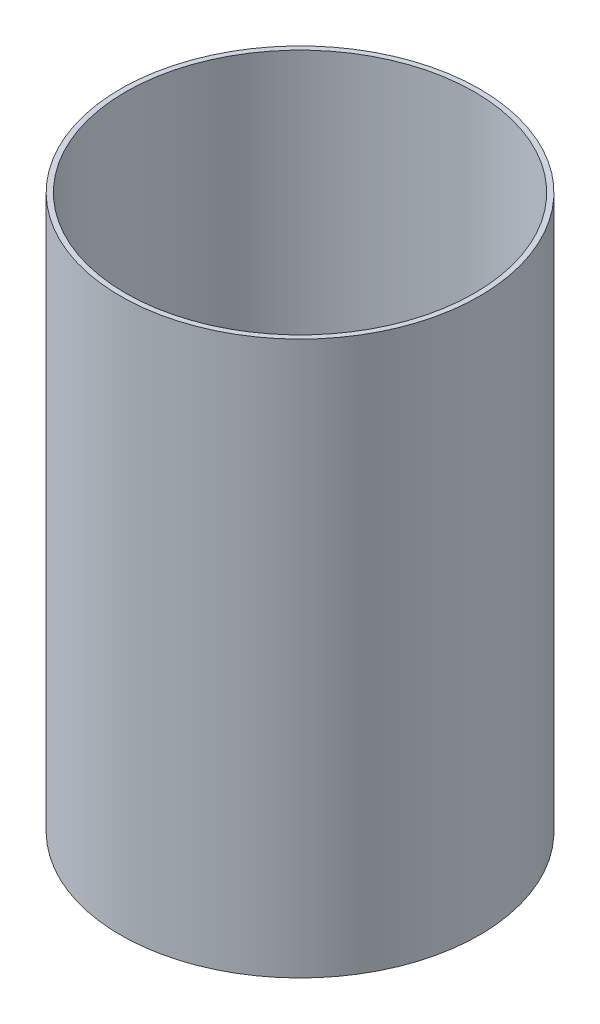
ISO-10303-21;
HEADER;
FILE_DESCRIPTION(('STEP AP214'),'2;1');
FILE_NAME('part.step','',(''),(''),'','','');
FILE_SCHEMA(('AUTOMOTIVE_DESIGN { 1 0 10303 214 1 1 1 1 }'));
ENDSEC;
DATA;
#1=APPLICATION_CONTEXT('core data for automotive mechanical design processes');
#2=APPLICATION_PROTOCOL_DEFINITION('international standard','automotive_design',2000,#1);
#3=PRODUCT_CONTEXT('',#1,'mechanical');
#4=PRODUCT('Part','Part','',(#3));
#5=PRODUCT_RELATED_PRODUCT_CATEGORY('part','',(#4));
#6=PRODUCT_DEFINITION_FORMATION('','',#4);
#7=PRODUCT_DEFINITION_CONTEXT('part definition',#1,'design');
#8=PRODUCT_DEFINITION('design','',#6,#7);
#9=PRODUCT_DEFINITION_SHAPE('','',#8);
#10=(LENGTH_UNIT() NAMED_UNIT(*) SI_UNIT(.MILLI.,.METRE.));
#11=(NAMED_UNIT(*) PLANE_ANGLE_UNIT() SI_UNIT($,.RADIAN.));
#12=(NAMED_UNIT(*) SI_UNIT($,.STERADIAN.) SOLID_ANGLE_UNIT());
#13=UNCERTAINTY_MEASURE_WITH_UNIT(LENGTH_MEASURE(1.E-05),#10,'distance_accuracy_value','');
#14=(GEOMETRIC_REPRESENTATION_CONTEXT(3) GLOBAL_UNCERTAINTY_ASSIGNED_CONTEXT((#13)) GLOBAL_UNIT_ASSIGNED_CONTEXT((#10,
#11,#12)) REPRESENTATION_CONTEXT('',''));
#15=CARTESIAN_POINT('',(0.,0.,0.));
#16=DIRECTION('',(0.,0.,1.));
#17=DIRECTION('',(1.,0.,0.));
#18=AXIS2_PLACEMENT_3D('',#15,#16,#17);
#19=CARTESIAN_POINT('',(0.,152.4,0.));
#20=DIRECTION('',(0.,1.,0.));
#21=DIRECTION('',(0.,0.,1.));
#22=AXIS2_PLACEMENT_3D('',#19,#20,#21);
#23=PLANE('',#22);
#24=CARTESIAN_POINT('',(0.,152.4,0.));
#25=DIRECTION('',(0.,1.,0.));
#26=DIRECTION('',(0.,0.,1.));
#27=AXIS2_PLACEMENT_3D('',#24,#25,#26);
#28=CIRCLE('',#27,49.4538);
#29=CARTESIAN_POINT('',(0.,152.4,-49.4538));
#30=VERTEX_POINT('',#29);
#31=EDGE_CURVE('E10',#30,#30,#28,.T.);
#32=ORIENTED_EDGE('',*,*,#31,.T.);
#33=EDGE_LOOP('',(#32));
#34=FACE_BOUND('',#33,.T.);
#35=CARTESIAN_POINT('',(0.,152.4,0.));
#36=DIRECTION('',(0.,1.,0.));
#37=DIRECTION('',(0.,0.,1.));
#38=AXIS2_PLACEMENT_3D('',#35,#36,#37);
#39=CIRCLE('',#38,48.0441);
#40=CARTESIAN_POINT('',(0.,152.4,-48.0441));
#41=VERTEX_POINT('',#40);
#42=EDGE_CURVE('E43',#41,#41,#39,.T.);
#43=ORIENTED_EDGE('',*,*,#42,.F.);
#44=EDGE_LOOP('',(#43));
#45=FACE_BOUND('',#44,.T.);
#46=ADVANCED_FACE('F32',(#34,#45),#23,.T.);
#47=CARTESIAN_POINT('',(0.,0.,0.));
#48=DIRECTION('',(0.,1.,0.));
#49=DIRECTION('',(0.,0.,1.));
#50=AXIS2_PLACEMENT_3D('',#47,#48,#49);
#51=PLANE('',#50);
#52=CARTESIAN_POINT('',(0.,0.,0.));
#53=DIRECTION('',(0.,1.,0.));
#54=DIRECTION('',(0.,0.,1.));
#55=AXIS2_PLACEMENT_3D('',#52,#53,#54);
#56=CIRCLE('',#55,49.4538);
#57=CARTESIAN_POINT('',(0.,0.,-49.4538));
#58=VERTEX_POINT('',#57);
#59=EDGE_CURVE('E36',#58,#58,#56,.T.);
#60=ORIENTED_EDGE('',*,*,#59,.F.);
#61=EDGE_LOOP('',(#60));
#62=FACE_BOUND('',#61,.T.);
#63=CARTESIAN_POINT('',(0.,0.,0.));
#64=DIRECTION('',(0.,1.,0.));
#65=DIRECTION('',(0.,0.,1.));
#66=AXIS2_PLACEMENT_3D('',#63,#64,#65);
#67=CIRCLE('',#66,48.0441);
#68=CARTESIAN_POINT('',(0.,0.,-48.0441));
#69=VERTEX_POINT('',#68);
#70=EDGE_CURVE('E45',#69,#69,#67,.T.);
#71=ORIENTED_EDGE('',*,*,#70,.T.);
#72=EDGE_LOOP('',(#71));
#73=FACE_BOUND('',#72,.T.);
#74=ADVANCED_FACE('F55',(#62,#73),#51,.F.);
#75=CARTESIAN_POINT('',(0.,152.4,0.));
#76=DIRECTION('',(0.,-1.,0.));
#77=DIRECTION('',(0.,0.,-1.));
#78=AXIS2_PLACEMENT_3D('',#75,#76,#77);
#79=CYLINDRICAL_SURFACE('',#78,49.4538);
#80=CARTESIAN_POINT('',(0.,152.4,-49.4538));
#81=CARTESIAN_POINT('',(0.,150.8125,-49.4538));
#82=CARTESIAN_POINT('',(0.,149.225,-49.4538));
#83=CARTESIAN_POINT('',(0.,146.05,-49.4538));
#84=CARTESIAN_POINT('',(0.,144.4625,-49.4538));
#85=CARTESIAN_POINT('',(0.,141.2875,-49.4538));
#86=CARTESIAN_POINT('',(0.,139.7,-49.4538));
#87=CARTESIAN_POINT('',(0.,136.525,-49.4538));
#88=CARTESIAN_POINT('',(0.,134.9375,-49.4538));
#89=CARTESIAN_POINT('',(0.,131.7625,-49.4538));
#90=CARTESIAN_POINT('',(0.,130.175,-49.4538));
#91=CARTESIAN_POINT('',(0.,127.,-49.4538));
#92=CARTESIAN_POINT('',(0.,125.4125,-49.4538));
#93=CARTESIAN_POINT('',(0.,122.2375,-49.4538));
#94=CARTESIAN_POINT('',(0.,120.65,-49.4538));
#95=CARTESIAN_POINT('',(0.,117.475,-49.4538));
#96=CARTESIAN_POINT('',(0.,115.8875,-49.4538));
#97=CARTESIAN_POINT('',(0.,112.7125,-49.4538));
#98=CARTESIAN_POINT('',(0.,111.125,-49.4538));
#99=CARTESIAN_POINT('',(0.,107.95,-49.4538));
#100=CARTESIAN_POINT('',(0.,106.3625,-49.4538));
#101=CARTESIAN_POINT('',(0.,103.1875,-49.4538));
#102=CARTESIAN_POINT('',(0.,101.6,-49.4538));
#103=CARTESIAN_POINT('',(0.,98.425,-49.4538));
#104=CARTESIAN_POINT('',(0.,96.8375,-49.4538));
#105=CARTESIAN_POINT('',(0.,93.6625,-49.4538));
#106=CARTESIAN_POINT('',(0.,92.075,-49.4538));
#107=CARTESIAN_POINT('',(0.,88.9,-49.4538));
#108=CARTESIAN_POINT('',(0.,87.3125,-49.4538));
#109=CARTESIAN_POINT('',(0.,84.1375,-49.4538));
#110=CARTESIAN_POINT('',(0.,82.55,-49.4538));
#111=CARTESIAN_POINT('',(0.,79.375,-49.4538));
#112=CARTESIAN_POINT('',(0.,77.7875,-49.4538));
#113=CARTESIAN_POINT('',(0.,74.6125,-49.4538));
#114=CARTESIAN_POINT('',(0.,73.025,-49.4538));
#115=CARTESIAN_POINT('',(0.,69.85,-49.4538));
#116=CARTESIAN_POINT('',(0.,68.2625,-49.4538));
#117=CARTESIAN_POINT('',(0.,65.0875,-49.4538));
#118=CARTESIAN_POINT('',(0.,63.5,-49.4538));
#119=CARTESIAN_POINT('',(0.,60.325,-49.4538));
#120=CARTESIAN_POINT('',(0.,58.7375,-49.4538));
#121=CARTESIAN_POINT('',(0.,55.5625,-49.4538));
#122=CARTESIAN_POINT('',(0.,53.975,-49.4538));
#123=CARTESIAN_POINT('',(0.,50.8,-49.4538));
#124=CARTESIAN_POINT('',(0.,49.2125,-49.4538));
#125=CARTESIAN_POINT('',(0.,46.0375,-49.4538));
#126=CARTESIAN_POINT('',(0.,44.45,-49.4538));
#127=CARTESIAN_POINT('',(0.,41.275,-49.4538));
#128=CARTESIAN_POINT('',(0.,39.6875,-49.4538));
#129=CARTESIAN_POINT('',(0.,36.5125,-49.4538));
#130=CARTESIAN_POINT('',(0.,34.925,-49.4538));
#131=CARTESIAN_POINT('',(0.,31.75,-49.4538));
#132=CARTESIAN_POINT('',(0.,30.1625,-49.4538));
#133=CARTESIAN_POINT('',(0.,26.9875,-49.4538));
#134=CARTESIAN_POINT('',(0.,25.4,-49.4538));
#135=CARTESIAN_POINT('',(0.,22.225,-49.4538));
#136=CARTESIAN_POINT('',(0.,20.6375,-49.4538));
#137=CARTESIAN_POINT('',(0.,17.4625,-49.4538));
#138=CARTESIAN_POINT('',(0.,15.875,-49.4538));
#139=CARTESIAN_POINT('',(0.,12.7,-49.4538));
#140=CARTESIAN_POINT('',(0.,11.1125,-49.4538));
#141=CARTESIAN_POINT('',(0.,7.93750000000001,-49.4538));
#142=CARTESIAN_POINT('',(0.,6.35,-49.4538));
#143=CARTESIAN_POINT('',(0.,3.175,-49.4538));
#144=CARTESIAN_POINT('',(0.,1.5875,-49.4538));
#145=CARTESIAN_POINT('',(0.,0.,-49.4538));
#146=B_SPLINE_CURVE_WITH_KNOTS('',3,(#80,#81,#82,#83,#84,#85,#86,#87,#88,#89,#90,#91,#92,#93,
#94,#95,#96,#97,#98,#99,#100,#101,#102,#103,#104,#105,#106,#107,#108,#109,#110,#111,#112,#113,
#114,#115,#116,#117,#118,#119,#120,#121,#122,#123,#124,#125,#126,#127,#128,#129,#130,#131,#132,
#133,#134,#135,#136,#137,#138,#139,#140,#141,#142,#143,#144,#145),.UNSPECIFIED.,.F.,.F.,(4,2,2,
2,2,2,2,2,2,2,2,2,2,2,2,2,2,2,2,2,2,2,2,2,2,2,2,2,2,2,2,2,4),(0.,4.7625,9.52500000000001,
14.2875,19.05,23.8125,28.575,33.3375,38.1,42.8625,47.625,52.3875,57.15,61.9125,66.675,71.4375,
76.2,80.9625,85.725,90.4875,95.25,100.0125,104.775,109.5375,114.3,119.0625,123.825,128.5875,
133.35,138.1125,142.875,147.6375,152.4),.UNSPECIFIED.);
#147=EDGE_CURVE('BSEAM34',#30,#58,#146,.T.);
#148=ORIENTED_EDGE('',*,*,#31,.F.);
#149=ORIENTED_EDGE('',*,*,#59,.T.);
#150=ORIENTED_EDGE('',*,*,#147,.T.);
#151=ORIENTED_EDGE('',*,*,#147,.F.);
#152=EDGE_LOOP('',(#148,#150,#149,#151));
#153=FACE_BOUND('',#152,.T.);
#154=ADVANCED_FACE('F34',(#153),#79,.T.);
#155=CARTESIAN_POINT('',(0.,152.4,0.));
#156=DIRECTION('',(0.,-1.,0.));
#157=DIRECTION('',(0.,0.,-1.));
#158=AXIS2_PLACEMENT_3D('',#155,#156,#157);
#159=CYLINDRICAL_SURFACE('',#158,48.0441);
#160=CARTESIAN_POINT('',(0.,152.4,-48.0441));
#161=CARTESIAN_POINT('',(0.,150.8125,-48.0441));
#162=CARTESIAN_POINT('',(0.,149.225,-48.0441));
#163=CARTESIAN_POINT('',(0.,146.05,-48.0441));
#164=CARTESIAN_POINT('',(0.,144.4625,-48.0441));
#165=CARTESIAN_POINT('',(0.,141.2875,-48.0441));
#166=CARTESIAN_POINT('',(0.,139.7,-48.0441));
#167=CARTESIAN_POINT('',(0.,136.525,-48.0441));
#168=CARTESIAN_POINT('',(0.,134.9375,-48.0441));
#169=CARTESIAN_POINT('',(0.,131.7625,-48.0441));
#170=CARTESIAN_POINT('',(0.,130.175,-48.0441));
#171=CARTESIAN_POINT('',(0.,127.,-48.0441));
#172=CARTESIAN_POINT('',(0.,125.4125,-48.0441));
#173=CARTESIAN_POINT('',(0.,122.2375,-48.0441));
#174=CARTESIAN_POINT('',(0.,120.65,-48.0441));
#175=CARTESIAN_POINT('',(0.,117.475,-48.0441));
#176=CARTESIAN_POINT('',(0.,115.8875,-48.0441));
#177=CARTESIAN_POINT('',(0.,112.7125,-48.0441));
#178=CARTESIAN_POINT('',(0.,111.125,-48.0441));
#179=CARTESIAN_POINT('',(0.,107.95,-48.0441));
#180=CARTESIAN_POINT('',(0.,106.3625,-48.0441));
#181=CARTESIAN_POINT('',(0.,103.1875,-48.0441));
#182=CARTESIAN_POINT('',(0.,101.6,-48.0441));
#183=CARTESIAN_POINT('',(0.,98.425,-48.0441));
#184=CARTESIAN_POINT('',(0.,96.8375,-48.0441));
#185=CARTESIAN_POINT('',(0.,93.6625,-48.0441));
#186=CARTESIAN_POINT('',(0.,92.075,-48.0441));
#187=CARTESIAN_POINT('',(0.,88.9,-48.0441));
#188=CARTESIAN_POINT('',(0.,87.3125,-48.0441));
#189=CARTESIAN_POINT('',(0.,84.1375,-48.0441));
#190=CARTESIAN_POINT('',(0.,82.55,-48.0441));
#191=CARTESIAN_POINT('',(0.,79.375,-48.0441));
#192=CARTESIAN_POINT('',(0.,77.7875,-48.0441));
#193=CARTESIAN_POINT('',(0.,74.6125,-48.0441));
#194=CARTESIAN_POINT('',(0.,73.025,-48.0441));
#195=CARTESIAN_POINT('',(0.,69.85,-48.0441));
#196=CARTESIAN_POINT('',(0.,68.2625,-48.0441));
#197=CARTESIAN_POINT('',(0.,65.0875,-48.0441));
#198=CARTESIAN_POINT('',(0.,63.5,-48.0441));
#199=CARTESIAN_POINT('',(0.,60.325,-48.0441));
#200=CARTESIAN_POINT('',(0.,58.7375,-48.0441));
#201=CARTESIAN_POINT('',(0.,55.5625,-48.0441));
#202=CARTESIAN_POINT('',(0.,53.975,-48.0441));
#203=CARTESIAN_POINT('',(0.,50.8,-48.0441));
#204=CARTESIAN_POINT('',(0.,49.2125,-48.0441));
#205=CARTESIAN_POINT('',(0.,46.0375,-48.0441));
#206=CARTESIAN_POINT('',(0.,44.45,-48.0441));
#207=CARTESIAN_POINT('',(0.,41.275,-48.0441));
#208=CARTESIAN_POINT('',(0.,39.6875,-48.0441));
#209=CARTESIAN_POINT('',(0.,36.5125,-48.0441));
#210=CARTESIAN_POINT('',(0.,34.925,-48.0441));
#211=CARTESIAN_POINT('',(0.,31.75,-48.0441));
#212=CARTESIAN_POINT('',(0.,30.1625,-48.0441));
#213=CARTESIAN_POINT('',(0.,26.9875,-48.0441));
#214=CARTESIAN_POINT('',(0.,25.4,-48.0441));
#215=CARTESIAN_POINT('',(0.,22.225,-48.0441));
#216=CARTESIAN_POINT('',(0.,20.6375,-48.0441));
#217=CARTESIAN_POINT('',(0.,17.4625,-48.0441));
#218=CARTESIAN_POINT('',(0.,15.875,-48.0441));
#219=CARTESIAN_POINT('',(0.,12.7,-48.0441));
#220=CARTESIAN_POINT('',(0.,11.1125,-48.0441));
#221=CARTESIAN_POINT('',(0.,7.93750000000001,-48.0441));
#222=CARTESIAN_POINT('',(0.,6.35,-48.0441));
#223=CARTESIAN_POINT('',(0.,3.175,-48.0441));
#224=CARTESIAN_POINT('',(0.,1.5875,-48.0441));
#225=CARTESIAN_POINT('',(0.,0.,-48.0441));
#226=B_SPLINE_CURVE_WITH_KNOTS('',3,(#160,#161,#162,#163,#164,#165,#166,#167,#168,#169,#170,
#171,#172,#173,#174,#175,#176,#177,#178,#179,#180,#181,#182,#183,#184,#185,#186,#187,#188,#189,
#190,#191,#192,#193,#194,#195,#196,#197,#198,#199,#200,#201,#202,#203,#204,#205,#206,#207,#208,
#209,#210,#211,#212,#213,#214,#215,#216,#217,#218,#219,#220,#221,#222,#223,#224,#225),
.UNSPECIFIED.,.F.,.F.,(4,2,2,2,2,2,2,2,2,2,2,2,2,2,2,2,2,2,2,2,2,2,2,2,2,2,2,2,2,2,2,2,4),(0.,
4.7625,9.52500000000001,14.2875,19.05,23.8125,28.575,33.3375,38.1,42.8625,47.625,52.3875,57.15,
61.9125,66.675,71.4375,76.2,80.9625,85.725,90.4875,95.25,100.0125,104.775,109.5375,114.3,
119.0625,123.825,128.5875,133.35,138.1125,142.875,147.6375,152.4),.UNSPECIFIED.);
#227=EDGE_CURVE('BSEAM51',#41,#69,#226,.T.);
#228=ORIENTED_EDGE('',*,*,#42,.T.);
#229=ORIENTED_EDGE('',*,*,#70,.F.);
#230=ORIENTED_EDGE('',*,*,#227,.T.);
#231=ORIENTED_EDGE('',*,*,#227,.F.);
#232=EDGE_LOOP('',(#228,#230,#229,#231));
#233=FACE_BOUND('',#232,.T.);
#234=ADVANCED_FACE('F51',(#233),#159,.F.);
#235=CLOSED_SHELL('',(#46,#74,#154,#234));
#236=MANIFOLD_SOLID_BREP('B2',#235);
#237=ADVANCED_BREP_SHAPE_REPRESENTATION('',(#18,#236),#14);
#238=SHAPE_DEFINITION_REPRESENTATION(#9,#237);
ENDSEC;
END-ISO-10303-21;
